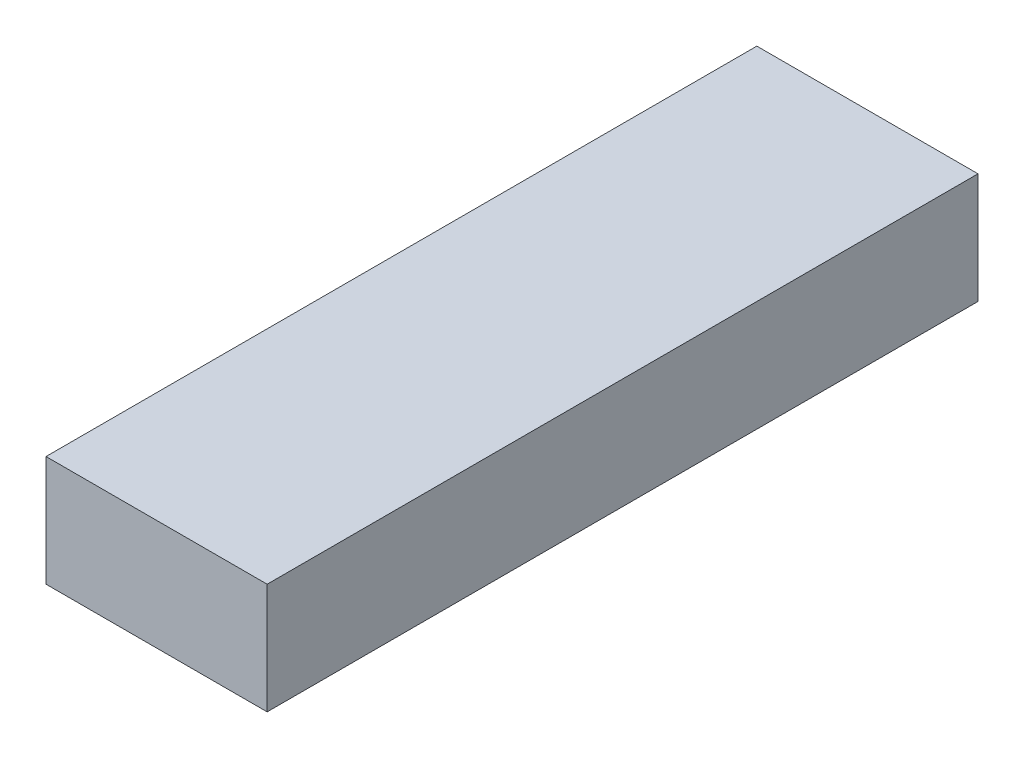
ISO-10303-21;
HEADER;
FILE_DESCRIPTION(('STEP AP214'),'2;1');
FILE_NAME('part.step','',(''),(''),'','','');
FILE_SCHEMA(('AUTOMOTIVE_DESIGN { 1 0 10303 214 1 1 1 1 }'));
ENDSEC;
DATA;
#1=APPLICATION_CONTEXT('core data for automotive mechanical design processes');
#2=APPLICATION_PROTOCOL_DEFINITION('international standard','automotive_design',2000,#1);
#3=PRODUCT_CONTEXT('',#1,'mechanical');
#4=PRODUCT('Part','Part','',(#3));
#5=PRODUCT_RELATED_PRODUCT_CATEGORY('part','',(#4));
#6=PRODUCT_DEFINITION_FORMATION('','',#4);
#7=PRODUCT_DEFINITION_CONTEXT('part definition',#1,'design');
#8=PRODUCT_DEFINITION('design','',#6,#7);
#9=PRODUCT_DEFINITION_SHAPE('','',#8);
#10=(LENGTH_UNIT() NAMED_UNIT(*) SI_UNIT(.MILLI.,.METRE.));
#11=(NAMED_UNIT(*) PLANE_ANGLE_UNIT() SI_UNIT($,.RADIAN.));
#12=(NAMED_UNIT(*) SI_UNIT($,.STERADIAN.) SOLID_ANGLE_UNIT());
#13=UNCERTAINTY_MEASURE_WITH_UNIT(LENGTH_MEASURE(1.E-05),#10,'distance_accuracy_value','');
#14=(GEOMETRIC_REPRESENTATION_CONTEXT(3) GLOBAL_UNCERTAINTY_ASSIGNED_CONTEXT((#13)) GLOBAL_UNIT_ASSIGNED_CONTEXT((#10,
#11,#12)) REPRESENTATION_CONTEXT('',''));
#15=CARTESIAN_POINT('',(0.,0.,0.));
#16=DIRECTION('',(0.,0.,1.));
#17=DIRECTION('',(1.,0.,0.));
#18=AXIS2_PLACEMENT_3D('',#15,#16,#17);
#19=CARTESIAN_POINT('',(0.,0.,45.));
#20=DIRECTION('',(1.,0.,0.));
#21=DIRECTION('',(0.,0.,-1.));
#22=AXIS2_PLACEMENT_3D('',#19,#20,#21);
#23=PLANE('',#22);
#24=DIRECTION('',(0.,-1.,0.));
#25=VECTOR('',#24,1.);
#26=CARTESIAN_POINT('',(0.,0.,0.));
#27=LINE('',#26,#25);
#28=CARTESIAN_POINT('',(0.,7.,0.));
#29=VERTEX_POINT('',#28);
#30=CARTESIAN_POINT('',(0.,0.,0.));
#31=VERTEX_POINT('',#30);
#32=EDGE_CURVE('E98',#29,#31,#27,.T.);
#33=ORIENTED_EDGE('',*,*,#32,.T.);
#34=DIRECTION('',(0.,0.,-1.));
#35=VECTOR('',#34,1.);
#36=CARTESIAN_POINT('',(0.,0.,45.));
#37=LINE('',#36,#35);
#38=CARTESIAN_POINT('',(0.,0.,45.));
#39=VERTEX_POINT('',#38);
#40=EDGE_CURVE('E11',#39,#31,#37,.T.);
#41=ORIENTED_EDGE('',*,*,#40,.F.);
#42=DIRECTION('',(0.,-1.,0.));
#43=VECTOR('',#42,1.);
#44=CARTESIAN_POINT('',(0.,0.,45.));
#45=LINE('',#44,#43);
#46=CARTESIAN_POINT('',(0.,7.,45.));
#47=VERTEX_POINT('',#46);
#48=EDGE_CURVE('E86',#47,#39,#45,.T.);
#49=ORIENTED_EDGE('',*,*,#48,.F.);
#50=DIRECTION('',(0.,0.,-1.));
#51=VECTOR('',#50,1.);
#52=CARTESIAN_POINT('',(0.,7.,45.));
#53=LINE('',#52,#51);
#54=EDGE_CURVE('E94',#47,#29,#53,.T.);
#55=ORIENTED_EDGE('',*,*,#54,.T.);
#56=EDGE_LOOP('',(#33,#41,#49,#55));
#57=FACE_BOUND('',#56,.T.);
#58=ADVANCED_FACE('F35',(#57),#23,.F.);
#59=CARTESIAN_POINT('',(0.,0.,45.));
#60=DIRECTION('',(0.,1.,0.));
#61=DIRECTION('',(0.,0.,1.));
#62=AXIS2_PLACEMENT_3D('',#59,#60,#61);
#63=PLANE('',#62);
#64=DIRECTION('',(1.,0.,0.));
#65=VECTOR('',#64,1.);
#66=CARTESIAN_POINT('',(0.,0.,0.));
#67=LINE('',#66,#65);
#68=CARTESIAN_POINT('',(14.,0.,0.));
#69=VERTEX_POINT('',#68);
#70=EDGE_CURVE('E90',#31,#69,#67,.T.);
#71=ORIENTED_EDGE('',*,*,#70,.T.);
#72=DIRECTION('',(0.,0.,-1.));
#73=VECTOR('',#72,1.);
#74=CARTESIAN_POINT('',(14.,0.,45.));
#75=LINE('',#74,#73);
#76=CARTESIAN_POINT('',(14.,0.,45.));
#77=VERTEX_POINT('',#76);
#78=EDGE_CURVE('E43',#77,#69,#75,.T.);
#79=ORIENTED_EDGE('',*,*,#78,.F.);
#80=DIRECTION('',(1.,0.,0.));
#81=VECTOR('',#80,1.);
#82=CARTESIAN_POINT('',(0.,0.,45.));
#83=LINE('',#82,#81);
#84=EDGE_CURVE('E81',#39,#77,#83,.T.);
#85=ORIENTED_EDGE('',*,*,#84,.F.);
#86=ORIENTED_EDGE('',*,*,#40,.T.);
#87=EDGE_LOOP('',(#71,#79,#85,#86));
#88=FACE_BOUND('',#87,.T.);
#89=ADVANCED_FACE('F89',(#88),#63,.F.);
#90=CARTESIAN_POINT('',(14.,0.,45.));
#91=DIRECTION('',(-1.,0.,0.));
#92=DIRECTION('',(0.,0.,1.));
#93=AXIS2_PLACEMENT_3D('',#90,#91,#92);
#94=PLANE('',#93);
#95=DIRECTION('',(0.,1.,0.));
#96=VECTOR('',#95,1.);
#97=CARTESIAN_POINT('',(14.,0.,0.));
#98=LINE('',#97,#96);
#99=CARTESIAN_POINT('',(14.,7.,0.));
#100=VERTEX_POINT('',#99);
#101=EDGE_CURVE('E68',#69,#100,#98,.T.);
#102=ORIENTED_EDGE('',*,*,#101,.T.);
#103=DIRECTION('',(0.,0.,-1.));
#104=VECTOR('',#103,1.);
#105=CARTESIAN_POINT('',(14.,7.,45.));
#106=LINE('',#105,#104);
#107=CARTESIAN_POINT('',(14.,7.,45.));
#108=VERTEX_POINT('',#107);
#109=EDGE_CURVE('E91',#108,#100,#106,.T.);
#110=ORIENTED_EDGE('',*,*,#109,.F.);
#111=DIRECTION('',(0.,1.,0.));
#112=VECTOR('',#111,1.);
#113=CARTESIAN_POINT('',(14.,0.,45.));
#114=LINE('',#113,#112);
#115=EDGE_CURVE('E84',#77,#108,#114,.T.);
#116=ORIENTED_EDGE('',*,*,#115,.F.);
#117=ORIENTED_EDGE('',*,*,#78,.T.);
#118=EDGE_LOOP('',(#102,#110,#116,#117));
#119=FACE_BOUND('',#118,.T.);
#120=ADVANCED_FACE('F92',(#119),#94,.F.);
#121=CARTESIAN_POINT('',(0.,7.,45.));
#122=DIRECTION('',(0.,-1.,0.));
#123=DIRECTION('',(0.,0.,-1.));
#124=AXIS2_PLACEMENT_3D('',#121,#122,#123);
#125=PLANE('',#124);
#126=DIRECTION('',(-1.,0.,0.));
#127=VECTOR('',#126,1.);
#128=CARTESIAN_POINT('',(0.,7.,0.));
#129=LINE('',#128,#127);
#130=EDGE_CURVE('E74',#100,#29,#129,.T.);
#131=ORIENTED_EDGE('',*,*,#130,.T.);
#132=ORIENTED_EDGE('',*,*,#54,.F.);
#133=DIRECTION('',(-1.,0.,0.));
#134=VECTOR('',#133,1.);
#135=CARTESIAN_POINT('',(0.,7.,45.));
#136=LINE('',#135,#134);
#137=EDGE_CURVE('E51',#108,#47,#136,.T.);
#138=ORIENTED_EDGE('',*,*,#137,.F.);
#139=ORIENTED_EDGE('',*,*,#109,.T.);
#140=EDGE_LOOP('',(#131,#132,#138,#139));
#141=FACE_BOUND('',#140,.T.);
#142=ADVANCED_FACE('F105',(#141),#125,.F.);
#143=CARTESIAN_POINT('',(0.,0.,45.));
#144=DIRECTION('',(0.,0.,-1.));
#145=DIRECTION('',(-1.,0.,0.));
#146=AXIS2_PLACEMENT_3D('',#143,#144,#145);
#147=PLANE('',#146);
#148=ORIENTED_EDGE('',*,*,#48,.T.);
#149=ORIENTED_EDGE('',*,*,#84,.T.);
#150=ORIENTED_EDGE('',*,*,#115,.T.);
#151=ORIENTED_EDGE('',*,*,#137,.T.);
#152=EDGE_LOOP('',(#148,#149,#150,#151));
#153=FACE_BOUND('',#152,.T.);
#154=ADVANCED_FACE('F82',(#153),#147,.F.);
#155=CARTESIAN_POINT('',(0.,0.,0.));
#156=DIRECTION('',(0.,0.,-1.));
#157=DIRECTION('',(-1.,0.,0.));
#158=AXIS2_PLACEMENT_3D('',#155,#156,#157);
#159=PLANE('',#158);
#160=ORIENTED_EDGE('',*,*,#32,.F.);
#161=ORIENTED_EDGE('',*,*,#130,.F.);
#162=ORIENTED_EDGE('',*,*,#101,.F.);
#163=ORIENTED_EDGE('',*,*,#70,.F.);
#164=EDGE_LOOP('',(#160,#161,#162,#163));
#165=FACE_BOUND('',#164,.T.);
#166=ADVANCED_FACE('F108',(#165),#159,.T.);
#167=CLOSED_SHELL('',(#58,#89,#120,#142,#154,#166));
#168=MANIFOLD_SOLID_BREP('B2',#167);
#169=ADVANCED_BREP_SHAPE_REPRESENTATION('',(#18,#168),#14);
#170=SHAPE_DEFINITION_REPRESENTATION(#9,#169);
ENDSEC;
END-ISO-10303-21;
